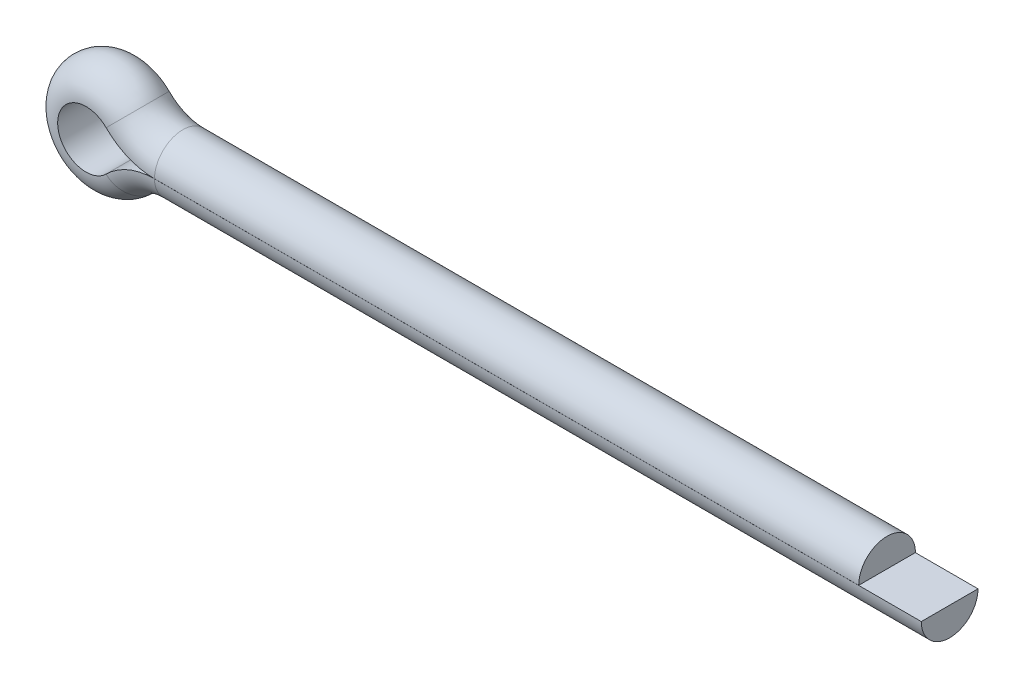
ISO-10303-21;
HEADER;
FILE_DESCRIPTION(('STEP AP214'),'2;1');
FILE_NAME('part.step','',(''),(''),'','','');
FILE_SCHEMA(('AUTOMOTIVE_DESIGN { 1 0 10303 214 1 1 1 1 }'));
ENDSEC;
DATA;
#1=APPLICATION_CONTEXT('core data for automotive mechanical design processes');
#2=APPLICATION_PROTOCOL_DEFINITION('international standard','automotive_design',2000,#1);
#3=PRODUCT_CONTEXT('',#1,'mechanical');
#4=PRODUCT('Part','Part','',(#3));
#5=PRODUCT_RELATED_PRODUCT_CATEGORY('part','',(#4));
#6=PRODUCT_DEFINITION_FORMATION('','',#4);
#7=PRODUCT_DEFINITION_CONTEXT('part definition',#1,'design');
#8=PRODUCT_DEFINITION('design','',#6,#7);
#9=PRODUCT_DEFINITION_SHAPE('','',#8);
#10=(LENGTH_UNIT() NAMED_UNIT(*) SI_UNIT(.MILLI.,.METRE.));
#11=(NAMED_UNIT(*) PLANE_ANGLE_UNIT() SI_UNIT($,.RADIAN.));
#12=(NAMED_UNIT(*) SI_UNIT($,.STERADIAN.) SOLID_ANGLE_UNIT());
#13=UNCERTAINTY_MEASURE_WITH_UNIT(LENGTH_MEASURE(1.E-05),#10,'distance_accuracy_value','');
#14=(GEOMETRIC_REPRESENTATION_CONTEXT(3) GLOBAL_UNCERTAINTY_ASSIGNED_CONTEXT((#13)) GLOBAL_UNIT_ASSIGNED_CONTEXT((#10,
#11,#12)) REPRESENTATION_CONTEXT('',''));
#15=CARTESIAN_POINT('',(0.,0.,0.));
#16=DIRECTION('',(0.,0.,1.));
#17=DIRECTION('',(1.,0.,0.));
#18=AXIS2_PLACEMENT_3D('',#15,#16,#17);
#19=CARTESIAN_POINT('',(0.,-0.00199999999999983,1.449998620689));
#20=DIRECTION('',(0.,-1.,0.));
#21=DIRECTION('',(1.,0.,0.));
#22=AXIS2_PLACEMENT_3D('',#19,#20,#21);
#23=PLANE('',#22);
#24=DIRECTION('',(0.,0.,-1.));
#25=VECTOR('',#24,1.);
#26=CARTESIAN_POINT('',(0.,-0.00199999999999983,1.449998620689));
#27=LINE('',#26,#25);
#28=CARTESIAN_POINT('',(0.,-0.00199999999999983,1.449998620689));
#29=VERTEX_POINT('',#28);
#30=CARTESIAN_POINT('',(0.,-0.00199999999999983,-1.449998620689));
#31=VERTEX_POINT('',#30);
#32=EDGE_CURVE('E140',#29,#31,#27,.T.);
#33=ORIENTED_EDGE('',*,*,#32,.F.);
#34=DIRECTION('',(1.,0.,0.));
#35=VECTOR('',#34,1.);
#36=CARTESIAN_POINT('',(0.,-0.00199999999999983,1.449998620689));
#37=LINE('',#36,#35);
#38=CARTESIAN_POINT('',(39.2,-0.00200000000000027,1.449998620689));
#39=VERTEX_POINT('',#38);
#40=EDGE_CURVE('E40',#29,#39,#37,.T.);
#41=ORIENTED_EDGE('',*,*,#40,.T.);
#42=DIRECTION('',(0.,0.,-1.));
#43=VECTOR('',#42,1.);
#44=CARTESIAN_POINT('',(39.2,-0.00200000000000027,1.449998620689));
#45=LINE('',#44,#43);
#46=CARTESIAN_POINT('',(39.2,-0.00200000000000027,-1.449998620689));
#47=VERTEX_POINT('',#46);
#48=EDGE_CURVE('E47',#39,#47,#45,.T.);
#49=ORIENTED_EDGE('',*,*,#48,.T.);
#50=DIRECTION('',(1.,0.,0.));
#51=VECTOR('',#50,1.);
#52=CARTESIAN_POINT('',(0.,-0.00199999999999983,-1.449998620689));
#53=LINE('',#52,#51);
#54=EDGE_CURVE('E11',#31,#47,#53,.T.);
#55=ORIENTED_EDGE('',*,*,#54,.F.);
#56=EDGE_LOOP('',(#33,#41,#49,#55));
#57=FACE_BOUND('',#56,.T.);
#58=ADVANCED_FACE('F33',(#57),#23,.F.);
#59=CARTESIAN_POINT('',(0.,0.,0.));
#60=DIRECTION('',(1.,0.,0.));
#61=DIRECTION('',(0.,1.,0.));
#62=AXIS2_PLACEMENT_3D('',#59,#60,#61);
#63=CYLINDRICAL_SURFACE('',#62,1.45);
#64=CARTESIAN_POINT('',(0.,0.,0.));
#65=DIRECTION('',(-1.,0.,0.));
#66=DIRECTION('',(0.,0.,-1.));
#67=AXIS2_PLACEMENT_3D('',#64,#65,#66);
#68=CIRCLE('',#67,1.45);
#69=EDGE_CURVE('E137',#31,#29,#68,.T.);
#70=ORIENTED_EDGE('',*,*,#69,.F.);
#71=ORIENTED_EDGE('',*,*,#54,.T.);
#72=CARTESIAN_POINT('',(39.2,0.,0.));
#73=DIRECTION('',(-1.,0.,0.));
#74=DIRECTION('',(0.,0.,-1.));
#75=AXIS2_PLACEMENT_3D('',#72,#73,#74);
#76=CIRCLE('',#75,1.45);
#77=EDGE_CURVE('E53',#47,#39,#76,.T.);
#78=ORIENTED_EDGE('',*,*,#77,.T.);
#79=ORIENTED_EDGE('',*,*,#40,.F.);
#80=EDGE_LOOP('',(#70,#71,#78,#79));
#81=FACE_BOUND('',#80,.T.);
#82=ADVANCED_FACE('F152',(#81),#63,.T.);
#83=CARTESIAN_POINT('',(0.,-3.49913793103448,0.));
#84=DIRECTION('',(0.,0.,-1.));
#85=DIRECTION('',(-1.,0.,0.));
#86=AXIS2_PLACEMENT_3D('',#83,#84,#85);
#87=CYLINDRICAL_SURFACE('',#86,3.49713793103448);
#88=DIRECTION('',(0.,0.,-1.));
#89=VECTOR('',#88,1.);
#90=CARTESIAN_POINT('',(-2.47315450269987,-1.02659257968994,1.449998620689));
#91=LINE('',#90,#89);
#92=CARTESIAN_POINT('',(-2.47315450269987,-1.02659257968994,1.449998620689));
#93=VERTEX_POINT('',#92);
#94=CARTESIAN_POINT('',(-2.47315450269987,-1.02659257968994,-1.449998620689));
#95=VERTEX_POINT('',#94);
#96=EDGE_CURVE('E128',#93,#95,#91,.T.);
#97=ORIENTED_EDGE('',*,*,#96,.F.);
#98=CARTESIAN_POINT('',(0.,-3.49913793103448,1.449998620689));
#99=DIRECTION('',(0.,0.,-1.));
#100=DIRECTION('',(-1.,0.,0.));
#101=AXIS2_PLACEMENT_3D('',#98,#99,#100);
#102=CIRCLE('',#101,3.49713793103448);
#103=EDGE_CURVE('E143',#93,#29,#102,.T.);
#104=ORIENTED_EDGE('',*,*,#103,.T.);
#105=ORIENTED_EDGE('',*,*,#32,.T.);
#106=CARTESIAN_POINT('',(0.,-3.49913793103448,-1.449998620689));
#107=DIRECTION('',(0.,0.,-1.));
#108=DIRECTION('',(-1.,0.,0.));
#109=AXIS2_PLACEMENT_3D('',#106,#107,#108);
#110=CIRCLE('',#109,3.49713793103448);
#111=EDGE_CURVE('E146',#95,#31,#110,.T.);
#112=ORIENTED_EDGE('',*,*,#111,.F.);
#113=EDGE_LOOP('',(#97,#104,#105,#112));
#114=FACE_BOUND('',#113,.T.);
#115=ADVANCED_FACE('F156',(#114),#87,.T.);
#116=CARTESIAN_POINT('',(0.,-3.49913793103448,0.));
#117=DIRECTION('',(0.,0.,-1.));
#118=DIRECTION('',(-1.,0.,0.));
#119=AXIS2_PLACEMENT_3D('',#116,#117,#118);
#120=TOROIDAL_SURFACE('',#119,3.49913793103448,1.45);
#121=CARTESIAN_POINT('',(-2.47456889043719,-1.02517854032397,0.));
#122=DIRECTION('',(-0.707019682982048,-0.707193868664007,0.));
#123=DIRECTION('',(0.,0.,-1.));
#124=AXIS2_PLACEMENT_3D('',#121,#122,#123);
#125=CIRCLE('',#124,1.45);
#126=EDGE_CURVE('E125',#95,#93,#125,.T.);
#127=ORIENTED_EDGE('',*,*,#126,.F.);
#128=ORIENTED_EDGE('',*,*,#111,.T.);
#129=ORIENTED_EDGE('',*,*,#69,.T.);
#130=ORIENTED_EDGE('',*,*,#103,.F.);
#131=EDGE_LOOP('',(#127,#128,#129,#130));
#132=FACE_BOUND('',#131,.T.);
#133=ADVANCED_FACE('F158',(#132),#120,.T.);
#134=CARTESIAN_POINT('',(-3.5,0.,0.));
#135=DIRECTION('',(0.,0.,1.));
#136=DIRECTION('',(1.,0.,0.));
#137=AXIS2_PLACEMENT_3D('',#134,#135,#136);
#138=CYLINDRICAL_SURFACE('',#137,1.452);
#139=DIRECTION('',(0.,0.,-1.));
#140=VECTOR('',#139,1.);
#141=CARTESIAN_POINT('',(-2.47315450269988,1.02659257968995,1.449998620689));
#142=LINE('',#141,#140);
#143=CARTESIAN_POINT('',(-2.47315450269988,1.02659257968995,1.449998620689));
#144=VERTEX_POINT('',#143);
#145=CARTESIAN_POINT('',(-2.47315450269988,1.02659257968995,-1.449998620689));
#146=VERTEX_POINT('',#145);
#147=EDGE_CURVE('E97',#144,#146,#142,.T.);
#148=ORIENTED_EDGE('',*,*,#147,.F.);
#149=CARTESIAN_POINT('',(-3.5,0.,1.449998620689));
#150=DIRECTION('',(0.,0.,1.));
#151=DIRECTION('',(1.,0.,0.));
#152=AXIS2_PLACEMENT_3D('',#149,#150,#151);
#153=CIRCLE('',#152,1.452);
#154=EDGE_CURVE('E131',#144,#93,#153,.T.);
#155=ORIENTED_EDGE('',*,*,#154,.T.);
#156=ORIENTED_EDGE('',*,*,#96,.T.);
#157=CARTESIAN_POINT('',(-3.5,0.,-1.449998620689));
#158=DIRECTION('',(0.,0.,1.));
#159=DIRECTION('',(1.,0.,0.));
#160=AXIS2_PLACEMENT_3D('',#157,#158,#159);
#161=CIRCLE('',#160,1.452);
#162=EDGE_CURVE('E134',#146,#95,#161,.T.);
#163=ORIENTED_EDGE('',*,*,#162,.F.);
#164=EDGE_LOOP('',(#148,#155,#156,#163));
#165=FACE_BOUND('',#164,.T.);
#166=ADVANCED_FACE('F162',(#165),#138,.F.);
#167=CARTESIAN_POINT('',(-3.5,0.,0.));
#168=DIRECTION('',(0.,0.,1.));
#169=DIRECTION('',(1.,0.,0.));
#170=AXIS2_PLACEMENT_3D('',#167,#168,#169);
#171=TOROIDAL_SURFACE('',#170,1.45,1.45);
#172=CARTESIAN_POINT('',(-2.4745688904372,1.02517854032398,0.));
#173=DIRECTION('',(0.707019682982059,-0.707193868663995,0.));
#174=DIRECTION('',(0.,0.,-1.));
#175=AXIS2_PLACEMENT_3D('',#172,#173,#174);
#176=CIRCLE('',#175,1.45);
#177=EDGE_CURVE('E93',#146,#144,#176,.T.);
#178=ORIENTED_EDGE('',*,*,#177,.F.);
#179=ORIENTED_EDGE('',*,*,#162,.T.);
#180=ORIENTED_EDGE('',*,*,#126,.T.);
#181=ORIENTED_EDGE('',*,*,#154,.F.);
#182=EDGE_LOOP('',(#178,#179,#180,#181));
#183=FACE_BOUND('',#182,.T.);
#184=ADVANCED_FACE('F163',(#183),#171,.T.);
#185=CARTESIAN_POINT('',(0.,3.49913793103448,0.));
#186=DIRECTION('',(0.,0.,-1.));
#187=DIRECTION('',(-1.,0.,0.));
#188=AXIS2_PLACEMENT_3D('',#185,#186,#187);
#189=CYLINDRICAL_SURFACE('',#188,3.49713793103448);
#190=DIRECTION('',(0.,0.,-1.));
#191=VECTOR('',#190,1.);
#192=CARTESIAN_POINT('',(0.,0.00199999999999978,1.449998620689));
#193=LINE('',#192,#191);
#194=CARTESIAN_POINT('',(0.,0.00199999999999978,1.449998620689));
#195=VERTEX_POINT('',#194);
#196=CARTESIAN_POINT('',(0.,0.00199999999999978,-1.449998620689));
#197=VERTEX_POINT('',#196);
#198=EDGE_CURVE('E100',#195,#197,#193,.T.);
#199=ORIENTED_EDGE('',*,*,#198,.F.);
#200=CARTESIAN_POINT('',(0.,3.49913793103448,1.449998620689));
#201=DIRECTION('',(0.,0.,-1.));
#202=DIRECTION('',(-1.,0.,0.));
#203=AXIS2_PLACEMENT_3D('',#200,#201,#202);
#204=CIRCLE('',#203,3.49713793103448);
#205=EDGE_CURVE('E85',#195,#144,#204,.T.);
#206=ORIENTED_EDGE('',*,*,#205,.T.);
#207=ORIENTED_EDGE('',*,*,#147,.T.);
#208=CARTESIAN_POINT('',(0.,3.49913793103448,-1.449998620689));
#209=DIRECTION('',(0.,0.,-1.));
#210=DIRECTION('',(-1.,0.,0.));
#211=AXIS2_PLACEMENT_3D('',#208,#209,#210);
#212=CIRCLE('',#211,3.49713793103448);
#213=EDGE_CURVE('E96',#197,#146,#212,.T.);
#214=ORIENTED_EDGE('',*,*,#213,.F.);
#215=EDGE_LOOP('',(#199,#206,#207,#214));
#216=FACE_BOUND('',#215,.T.);
#217=ADVANCED_FACE('F102',(#216),#189,.T.);
#218=CARTESIAN_POINT('',(0.,3.49913793103448,0.));
#219=DIRECTION('',(0.,0.,-1.));
#220=DIRECTION('',(-1.,0.,0.));
#221=AXIS2_PLACEMENT_3D('',#218,#219,#220);
#222=TOROIDAL_SURFACE('',#221,3.49913793103448,1.45);
#223=CARTESIAN_POINT('',(0.,0.,0.));
#224=DIRECTION('',(1.,0.,0.));
#225=DIRECTION('',(0.,0.,-1.));
#226=AXIS2_PLACEMENT_3D('',#223,#224,#225);
#227=CIRCLE('',#226,1.45);
#228=EDGE_CURVE('E90',#197,#195,#227,.T.);
#229=ORIENTED_EDGE('',*,*,#228,.F.);
#230=ORIENTED_EDGE('',*,*,#213,.T.);
#231=ORIENTED_EDGE('',*,*,#177,.T.);
#232=ORIENTED_EDGE('',*,*,#205,.F.);
#233=EDGE_LOOP('',(#229,#230,#231,#232));
#234=FACE_BOUND('',#233,.T.);
#235=ADVANCED_FACE('F87',(#234),#222,.T.);
#236=CARTESIAN_POINT('',(0.,0.,0.));
#237=DIRECTION('',(1.,0.,0.));
#238=DIRECTION('',(0.,1.,0.));
#239=AXIS2_PLACEMENT_3D('',#236,#237,#238);
#240=CYLINDRICAL_SURFACE('',#239,1.45);
#241=CARTESIAN_POINT('',(36.,0.,0.));
#242=DIRECTION('',(1.,0.,0.));
#243=DIRECTION('',(0.,0.,-1.));
#244=AXIS2_PLACEMENT_3D('',#241,#242,#243);
#245=CIRCLE('',#244,1.45);
#246=CARTESIAN_POINT('',(36.,0.002,-1.449998620689));
#247=VERTEX_POINT('',#246);
#248=CARTESIAN_POINT('',(36.,0.002,1.449998620689));
#249=VERTEX_POINT('',#248);
#250=EDGE_CURVE('E117',#247,#249,#245,.T.);
#251=ORIENTED_EDGE('',*,*,#250,.F.);
#252=DIRECTION('',(1.,0.,0.));
#253=VECTOR('',#252,1.);
#254=CARTESIAN_POINT('',(0.,0.00199999999999978,-1.449998620689));
#255=LINE('',#254,#253);
#256=EDGE_CURVE('E113',#197,#247,#255,.T.);
#257=ORIENTED_EDGE('',*,*,#256,.F.);
#258=ORIENTED_EDGE('',*,*,#228,.T.);
#259=DIRECTION('',(1.,0.,0.));
#260=VECTOR('',#259,1.);
#261=CARTESIAN_POINT('',(0.,0.00199999999999978,1.449998620689));
#262=LINE('',#261,#260);
#263=EDGE_CURVE('E104',#195,#249,#262,.T.);
#264=ORIENTED_EDGE('',*,*,#263,.T.);
#265=EDGE_LOOP('',(#251,#257,#258,#264));
#266=FACE_BOUND('',#265,.T.);
#267=ADVANCED_FACE('F115',(#266),#240,.T.);
#268=CARTESIAN_POINT('',(0.,0.00199999999999978,1.449998620689));
#269=DIRECTION('',(0.,-1.,0.));
#270=DIRECTION('',(1.,0.,0.));
#271=AXIS2_PLACEMENT_3D('',#268,#269,#270);
#272=PLANE('',#271);
#273=DIRECTION('',(0.,0.,-1.));
#274=VECTOR('',#273,1.);
#275=CARTESIAN_POINT('',(36.,0.002,1.449998620689));
#276=LINE('',#275,#274);
#277=EDGE_CURVE('E109',#249,#247,#276,.T.);
#278=ORIENTED_EDGE('',*,*,#277,.F.);
#279=ORIENTED_EDGE('',*,*,#263,.F.);
#280=ORIENTED_EDGE('',*,*,#198,.T.);
#281=ORIENTED_EDGE('',*,*,#256,.T.);
#282=EDGE_LOOP('',(#278,#279,#280,#281));
#283=FACE_BOUND('',#282,.T.);
#284=ADVANCED_FACE('F107',(#283),#272,.T.);
#285=CARTESIAN_POINT('',(39.2,0.,0.));
#286=DIRECTION('',(-1.,0.,0.));
#287=DIRECTION('',(0.,0.,-1.));
#288=AXIS2_PLACEMENT_3D('',#285,#286,#287);
#289=PLANE('',#288);
#290=ORIENTED_EDGE('',*,*,#77,.F.);
#291=ORIENTED_EDGE('',*,*,#48,.F.);
#292=EDGE_LOOP('',(#290,#291));
#293=FACE_BOUND('',#292,.T.);
#294=ADVANCED_FACE('F225',(#293),#289,.F.);
#295=CARTESIAN_POINT('',(36.,0.,0.));
#296=DIRECTION('',(1.,0.,0.));
#297=DIRECTION('',(0.,0.,-1.));
#298=AXIS2_PLACEMENT_3D('',#295,#296,#297);
#299=PLANE('',#298);
#300=ORIENTED_EDGE('',*,*,#250,.T.);
#301=ORIENTED_EDGE('',*,*,#277,.T.);
#302=EDGE_LOOP('',(#300,#301));
#303=FACE_BOUND('',#302,.T.);
#304=ADVANCED_FACE('F234',(#303),#299,.T.);
#305=CLOSED_SHELL('',(#58,#82,#115,#133,#166,#184,#217,#235,#267,#284,#294,#304));
#306=MANIFOLD_SOLID_BREP('B2',#305);
#307=ADVANCED_BREP_SHAPE_REPRESENTATION('',(#18,#306),#14);
#308=SHAPE_DEFINITION_REPRESENTATION(#9,#307);
ENDSEC;
END-ISO-10303-21;
